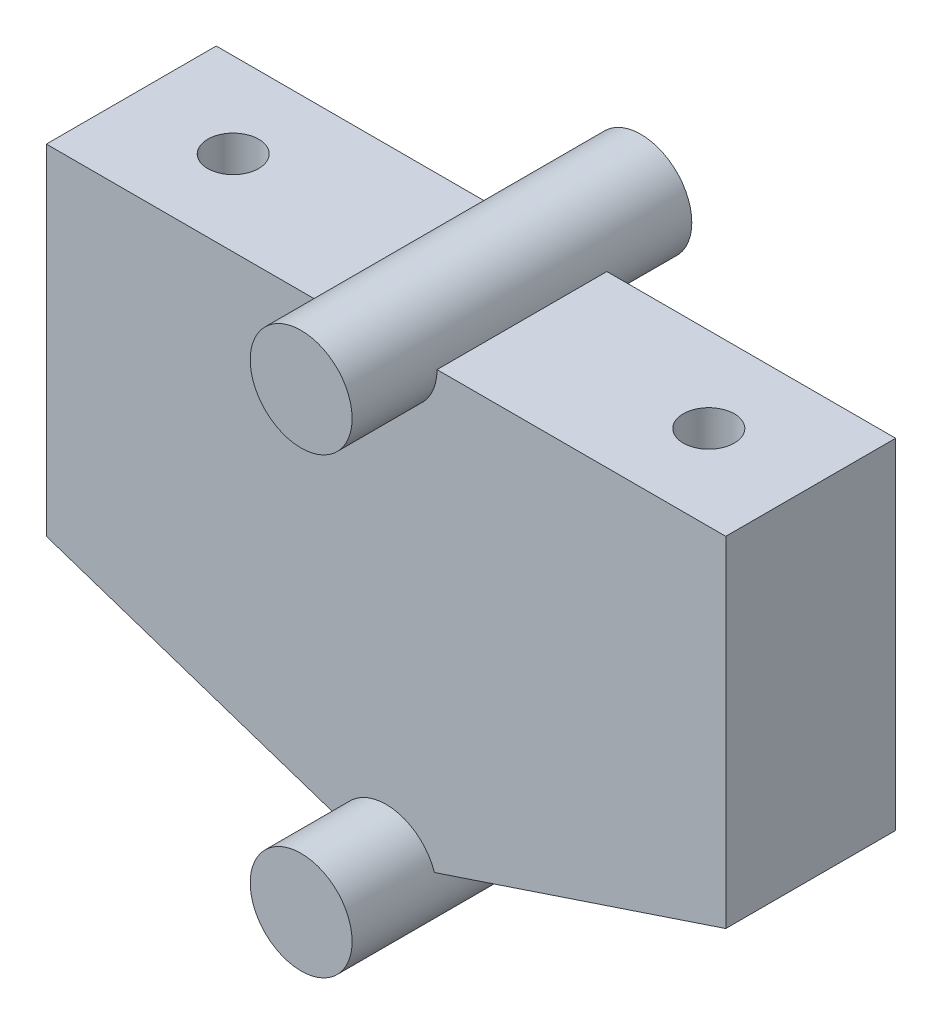
ISO-10303-21;
HEADER;
FILE_DESCRIPTION(('STEP AP214'),'2;1');
FILE_NAME('part.step','',(''),(''),'','','');
FILE_SCHEMA(('AUTOMOTIVE_DESIGN { 1 0 10303 214 1 1 1 1 }'));
ENDSEC;
DATA;
#1=APPLICATION_CONTEXT('core data for automotive mechanical design processes');
#2=APPLICATION_PROTOCOL_DEFINITION('international standard','automotive_design',2000,#1);
#3=PRODUCT_CONTEXT('',#1,'mechanical');
#4=PRODUCT('Part','Part','',(#3));
#5=PRODUCT_RELATED_PRODUCT_CATEGORY('part','',(#4));
#6=PRODUCT_DEFINITION_FORMATION('','',#4);
#7=PRODUCT_DEFINITION_CONTEXT('part definition',#1,'design');
#8=PRODUCT_DEFINITION('design','',#6,#7);
#9=PRODUCT_DEFINITION_SHAPE('','',#8);
#10=(LENGTH_UNIT() NAMED_UNIT(*) SI_UNIT(.MILLI.,.METRE.));
#11=(NAMED_UNIT(*) PLANE_ANGLE_UNIT() SI_UNIT($,.RADIAN.));
#12=(NAMED_UNIT(*) SI_UNIT($,.STERADIAN.) SOLID_ANGLE_UNIT());
#13=UNCERTAINTY_MEASURE_WITH_UNIT(LENGTH_MEASURE(1.E-05),#10,'distance_accuracy_value','');
#14=(GEOMETRIC_REPRESENTATION_CONTEXT(3) GLOBAL_UNCERTAINTY_ASSIGNED_CONTEXT((#13)) GLOBAL_UNIT_ASSIGNED_CONTEXT((#10,
#11,#12)) REPRESENTATION_CONTEXT('',''));
#15=CARTESIAN_POINT('',(0.,0.,0.));
#16=DIRECTION('',(0.,0.,1.));
#17=DIRECTION('',(1.,0.,0.));
#18=AXIS2_PLACEMENT_3D('',#15,#16,#17);
#19=CARTESIAN_POINT('',(0.,10.,10.));
#20=DIRECTION('',(0.,1.,0.));
#21=DIRECTION('',(0.,0.,1.));
#22=AXIS2_PLACEMENT_3D('',#19,#20,#21);
#23=PLANE('',#22);
#24=DIRECTION('',(0.,0.,1.));
#25=VECTOR('',#24,1.);
#26=CARTESIAN_POINT('',(-3.,10.,-5.));
#27=LINE('',#26,#25);
#28=CARTESIAN_POINT('',(-3.,10.,0.));
#29=VERTEX_POINT('',#28);
#30=CARTESIAN_POINT('',(-3.,10.,10.));
#31=VERTEX_POINT('',#30);
#32=EDGE_CURVE('E114',#29,#31,#27,.T.);
#33=ORIENTED_EDGE('',*,*,#32,.F.);
#34=DIRECTION('',(1.,0.,0.));
#35=VECTOR('',#34,1.);
#36=CARTESIAN_POINT('',(0.,10.,0.));
#37=LINE('',#36,#35);
#38=CARTESIAN_POINT('',(-20.,10.,0.));
#39=VERTEX_POINT('',#38);
#40=EDGE_CURVE('E123',#39,#29,#37,.T.);
#41=ORIENTED_EDGE('',*,*,#40,.F.);
#42=DIRECTION('',(0.,0.,-1.));
#43=VECTOR('',#42,1.);
#44=CARTESIAN_POINT('',(-20.,10.,10.));
#45=LINE('',#44,#43);
#46=CARTESIAN_POINT('',(-20.,10.,10.));
#47=VERTEX_POINT('',#46);
#48=EDGE_CURVE('E146',#47,#39,#45,.T.);
#49=ORIENTED_EDGE('',*,*,#48,.F.);
#50=DIRECTION('',(1.,0.,0.));
#51=VECTOR('',#50,1.);
#52=CARTESIAN_POINT('',(0.,10.,10.));
#53=LINE('',#52,#51);
#54=EDGE_CURVE('E124',#47,#31,#53,.T.);
#55=ORIENTED_EDGE('',*,*,#54,.T.);
#56=EDGE_LOOP('',(#33,#41,#49,#55));
#57=FACE_BOUND('',#56,.T.);
#58=CARTESIAN_POINT('',(-14.,10.,5.));
#59=DIRECTION('',(0.,1.,0.));
#60=DIRECTION('',(0.,0.,1.));
#61=AXIS2_PLACEMENT_3D('',#58,#59,#60);
#62=CIRCLE('',#61,1.5);
#63=CARTESIAN_POINT('',(-14.,10.,6.5));
#64=VERTEX_POINT('',#63);
#65=EDGE_CURVE('E157',#64,#64,#62,.T.);
#66=ORIENTED_EDGE('',*,*,#65,.F.);
#67=EDGE_LOOP('',(#66));
#68=FACE_BOUND('',#67,.T.);
#69=ADVANCED_FACE('F39',(#57,#68),#23,.T.);
#70=CARTESIAN_POINT('',(5.,-15.,10.));
#71=DIRECTION('',(-0.316227766016838,0.948683298050514,0.));
#72=DIRECTION('',(-0.948683298050514,-0.316227766016838,0.));
#73=AXIS2_PLACEMENT_3D('',#70,#71,#72);
#74=PLANE('',#73);
#75=CARTESIAN_POINT('',(14.,-12.,5.));
#76=DIRECTION('',(-0.316227766016838,0.948683298050514,0.));
#77=DIRECTION('',(0.948683298050514,0.316227766016838,0.));
#78=AXIS2_PLACEMENT_3D('',#75,#76,#77);
#79=ELLIPSE('',#78,1.58113883008419,1.5);
#80=CARTESIAN_POINT('',(15.5,-11.5,5.));
#81=VERTEX_POINT('',#80);
#82=EDGE_CURVE('E156',#81,#81,#79,.T.);
#83=ORIENTED_EDGE('',*,*,#82,.T.);
#84=EDGE_LOOP('',(#83));
#85=FACE_BOUND('',#84,.T.);
#86=DIRECTION('',(0.948683298050514,0.316227766016838,0.));
#87=VECTOR('',#86,1.);
#88=CARTESIAN_POINT('',(5.,-15.,0.));
#89=LINE('',#88,#87);
#90=CARTESIAN_POINT('',(2.84604989415154,-15.7179833686162,0.));
#91=VERTEX_POINT('',#90);
#92=CARTESIAN_POINT('',(20.,-10.,0.));
#93=VERTEX_POINT('',#92);
#94=EDGE_CURVE('E188',#91,#93,#89,.T.);
#95=ORIENTED_EDGE('',*,*,#94,.T.);
#96=DIRECTION('',(0.,0.,-1.));
#97=VECTOR('',#96,1.);
#98=CARTESIAN_POINT('',(20.,-10.,10.));
#99=LINE('',#98,#97);
#100=CARTESIAN_POINT('',(20.,-10.,10.));
#101=VERTEX_POINT('',#100);
#102=EDGE_CURVE('E151',#101,#93,#99,.T.);
#103=ORIENTED_EDGE('',*,*,#102,.F.);
#104=DIRECTION('',(0.948683298050514,0.316227766016838,0.));
#105=VECTOR('',#104,1.);
#106=CARTESIAN_POINT('',(5.,-15.,10.));
#107=LINE('',#106,#105);
#108=CARTESIAN_POINT('',(2.84604989415154,-15.7179833686162,10.));
#109=VERTEX_POINT('',#108);
#110=EDGE_CURVE('E95',#109,#101,#107,.T.);
#111=ORIENTED_EDGE('',*,*,#110,.F.);
#112=DIRECTION('',(0.,0.,-1.));
#113=VECTOR('',#112,1.);
#114=CARTESIAN_POINT('',(2.84604989415154,-15.7179833686162,10.));
#115=LINE('',#114,#113);
#116=EDGE_CURVE('E47',#109,#91,#115,.T.);
#117=ORIENTED_EDGE('',*,*,#116,.T.);
#118=EDGE_LOOP('',(#95,#103,#111,#117));
#119=FACE_BOUND('',#118,.T.);
#120=ADVANCED_FACE('F41',(#85,#119),#74,.F.);
#121=CARTESIAN_POINT('',(20.,0.,10.));
#122=DIRECTION('',(1.,0.,0.));
#123=DIRECTION('',(0.,1.,0.));
#124=AXIS2_PLACEMENT_3D('',#121,#122,#123);
#125=PLANE('',#124);
#126=DIRECTION('',(0.,-1.,0.));
#127=VECTOR('',#126,1.);
#128=CARTESIAN_POINT('',(20.,0.,0.));
#129=LINE('',#128,#127);
#130=CARTESIAN_POINT('',(20.,10.,0.));
#131=VERTEX_POINT('',#130);
#132=EDGE_CURVE('E135',#131,#93,#129,.T.);
#133=ORIENTED_EDGE('',*,*,#132,.F.);
#134=DIRECTION('',(0.,0.,-1.));
#135=VECTOR('',#134,1.);
#136=CARTESIAN_POINT('',(20.,10.,10.));
#137=LINE('',#136,#135);
#138=CARTESIAN_POINT('',(20.,10.,10.));
#139=VERTEX_POINT('',#138);
#140=EDGE_CURVE('E148',#139,#131,#137,.T.);
#141=ORIENTED_EDGE('',*,*,#140,.F.);
#142=DIRECTION('',(0.,-1.,0.));
#143=VECTOR('',#142,1.);
#144=CARTESIAN_POINT('',(20.,0.,10.));
#145=LINE('',#144,#143);
#146=EDGE_CURVE('E180',#139,#101,#145,.T.);
#147=ORIENTED_EDGE('',*,*,#146,.T.);
#148=ORIENTED_EDGE('',*,*,#102,.T.);
#149=EDGE_LOOP('',(#133,#141,#147,#148));
#150=FACE_BOUND('',#149,.T.);
#151=ADVANCED_FACE('F196',(#150),#125,.T.);
#152=DIRECTION('',(0.,0.,1.));
#153=VECTOR('',#152,1.);
#154=CARTESIAN_POINT('',(3.,10.,-5.));
#155=LINE('',#154,#153);
#156=CARTESIAN_POINT('',(3.,10.,10.));
#157=VERTEX_POINT('',#156);
#158=CARTESIAN_POINT('',(3.,10.,0.));
#159=VERTEX_POINT('',#158);
#160=EDGE_CURVE('E54',#157,#159,#155,.F.);
#161=ORIENTED_EDGE('',*,*,#160,.F.);
#162=EDGE_CURVE('E183',#157,#139,#53,.T.);
#163=ORIENTED_EDGE('',*,*,#162,.T.);
#164=ORIENTED_EDGE('',*,*,#140,.T.);
#165=EDGE_CURVE('E131',#159,#131,#37,.T.);
#166=ORIENTED_EDGE('',*,*,#165,.F.);
#167=EDGE_LOOP('',(#161,#163,#164,#166));
#168=FACE_BOUND('',#167,.T.);
#169=CARTESIAN_POINT('',(14.,10.,5.));
#170=DIRECTION('',(0.,1.,0.));
#171=DIRECTION('',(0.,0.,-1.));
#172=AXIS2_PLACEMENT_3D('',#169,#170,#171);
#173=CIRCLE('',#172,1.5);
#174=CARTESIAN_POINT('',(14.,10.,3.5));
#175=VERTEX_POINT('',#174);
#176=EDGE_CURVE('E164',#175,#175,#173,.T.);
#177=ORIENTED_EDGE('',*,*,#176,.F.);
#178=EDGE_LOOP('',(#177));
#179=FACE_BOUND('',#178,.T.);
#180=ADVANCED_FACE('F207',(#168,#179),#23,.T.);
#181=CARTESIAN_POINT('',(-20.,0.,10.));
#182=DIRECTION('',(1.,0.,0.));
#183=DIRECTION('',(0.,1.,0.));
#184=AXIS2_PLACEMENT_3D('',#181,#182,#183);
#185=PLANE('',#184);
#186=DIRECTION('',(0.,-1.,0.));
#187=VECTOR('',#186,1.);
#188=CARTESIAN_POINT('',(-20.,0.,0.));
#189=LINE('',#188,#187);
#190=CARTESIAN_POINT('',(-20.,-10.,0.));
#191=VERTEX_POINT('',#190);
#192=EDGE_CURVE('E130',#39,#191,#189,.T.);
#193=ORIENTED_EDGE('',*,*,#192,.T.);
#194=DIRECTION('',(0.,0.,-1.));
#195=VECTOR('',#194,1.);
#196=CARTESIAN_POINT('',(-20.,-10.,10.));
#197=LINE('',#196,#195);
#198=CARTESIAN_POINT('',(-20.,-10.,10.));
#199=VERTEX_POINT('',#198);
#200=EDGE_CURVE('E142',#199,#191,#197,.T.);
#201=ORIENTED_EDGE('',*,*,#200,.F.);
#202=DIRECTION('',(0.,-1.,0.));
#203=VECTOR('',#202,1.);
#204=CARTESIAN_POINT('',(-20.,0.,10.));
#205=LINE('',#204,#203);
#206=EDGE_CURVE('E62',#47,#199,#205,.T.);
#207=ORIENTED_EDGE('',*,*,#206,.F.);
#208=ORIENTED_EDGE('',*,*,#48,.T.);
#209=EDGE_LOOP('',(#193,#201,#207,#208));
#210=FACE_BOUND('',#209,.T.);
#211=ADVANCED_FACE('F204',(#210),#185,.F.);
#212=CARTESIAN_POINT('',(-5.,-15.,10.));
#213=DIRECTION('',(0.316227766016838,0.948683298050514,0.));
#214=DIRECTION('',(-0.948683298050514,0.316227766016838,0.));
#215=AXIS2_PLACEMENT_3D('',#212,#213,#214);
#216=PLANE('',#215);
#217=CARTESIAN_POINT('',(-14.,-12.,5.));
#218=DIRECTION('',(0.316227766016838,0.948683298050514,0.));
#219=DIRECTION('',(-0.948683298050514,0.316227766016838,0.));
#220=AXIS2_PLACEMENT_3D('',#217,#218,#219);
#221=ELLIPSE('',#220,1.58113883008419,1.5);
#222=CARTESIAN_POINT('',(-15.5,-11.5,5.));
#223=VERTEX_POINT('',#222);
#224=EDGE_CURVE('E154',#223,#223,#221,.T.);
#225=ORIENTED_EDGE('',*,*,#224,.T.);
#226=EDGE_LOOP('',(#225));
#227=FACE_BOUND('',#226,.T.);
#228=DIRECTION('',(0.948683298050514,-0.316227766016838,0.));
#229=VECTOR('',#228,1.);
#230=CARTESIAN_POINT('',(-5.,-15.,0.));
#231=LINE('',#230,#229);
#232=CARTESIAN_POINT('',(-2.84604989415154,-15.7179833686162,0.));
#233=VERTEX_POINT('',#232);
#234=EDGE_CURVE('E133',#191,#233,#231,.T.);
#235=ORIENTED_EDGE('',*,*,#234,.T.);
#236=DIRECTION('',(0.,0.,-1.));
#237=VECTOR('',#236,1.);
#238=CARTESIAN_POINT('',(-2.84604989415154,-15.7179833686162,10.));
#239=LINE('',#238,#237);
#240=CARTESIAN_POINT('',(-2.84604989415154,-15.7179833686162,10.));
#241=VERTEX_POINT('',#240);
#242=EDGE_CURVE('E88',#241,#233,#239,.T.);
#243=ORIENTED_EDGE('',*,*,#242,.F.);
#244=DIRECTION('',(0.948683298050514,-0.316227766016838,0.));
#245=VECTOR('',#244,1.);
#246=CARTESIAN_POINT('',(-5.,-15.,10.));
#247=LINE('',#246,#245);
#248=EDGE_CURVE('E143',#199,#241,#247,.T.);
#249=ORIENTED_EDGE('',*,*,#248,.F.);
#250=ORIENTED_EDGE('',*,*,#200,.T.);
#251=EDGE_LOOP('',(#235,#243,#249,#250));
#252=FACE_BOUND('',#251,.T.);
#253=ADVANCED_FACE('F202',(#227,#252),#216,.F.);
#254=CARTESIAN_POINT('',(0.,0.,10.));
#255=DIRECTION('',(0.,0.,1.));
#256=DIRECTION('',(1.,0.,0.));
#257=AXIS2_PLACEMENT_3D('',#254,#255,#256);
#258=PLANE('',#257);
#259=CARTESIAN_POINT('',(0.,10.,10.));
#260=DIRECTION('',(0.,0.,1.));
#261=DIRECTION('',(1.,0.,0.));
#262=AXIS2_PLACEMENT_3D('',#259,#260,#261);
#263=CIRCLE('',#262,3.);
#264=EDGE_CURVE('E125',#31,#157,#263,.T.);
#265=ORIENTED_EDGE('',*,*,#264,.F.);
#266=ORIENTED_EDGE('',*,*,#54,.F.);
#267=ORIENTED_EDGE('',*,*,#206,.T.);
#268=ORIENTED_EDGE('',*,*,#248,.T.);
#269=CARTESIAN_POINT('',(0.,-16.6666666666667,10.));
#270=DIRECTION('',(0.,0.,1.));
#271=DIRECTION('',(1.,0.,0.));
#272=AXIS2_PLACEMENT_3D('',#269,#270,#271);
#273=CIRCLE('',#272,3.);
#274=EDGE_CURVE('E140',#109,#241,#273,.T.);
#275=ORIENTED_EDGE('',*,*,#274,.F.);
#276=ORIENTED_EDGE('',*,*,#110,.T.);
#277=ORIENTED_EDGE('',*,*,#146,.F.);
#278=ORIENTED_EDGE('',*,*,#162,.F.);
#279=EDGE_LOOP('',(#265,#266,#267,#268,#275,#276,#277,#278));
#280=FACE_BOUND('',#279,.T.);
#281=ADVANCED_FACE('F197',(#280),#258,.T.);
#282=CARTESIAN_POINT('',(0.,0.,0.));
#283=DIRECTION('',(0.,0.,1.));
#284=DIRECTION('',(1.,0.,0.));
#285=AXIS2_PLACEMENT_3D('',#282,#283,#284);
#286=PLANE('',#285);
#287=ORIENTED_EDGE('',*,*,#40,.T.);
#288=CARTESIAN_POINT('',(0.,10.,0.));
#289=DIRECTION('',(0.,0.,1.));
#290=DIRECTION('',(1.,0.,0.));
#291=AXIS2_PLACEMENT_3D('',#288,#289,#290);
#292=CIRCLE('',#291,3.);
#293=EDGE_CURVE('E11',#29,#159,#292,.T.);
#294=ORIENTED_EDGE('',*,*,#293,.T.);
#295=ORIENTED_EDGE('',*,*,#165,.T.);
#296=ORIENTED_EDGE('',*,*,#132,.T.);
#297=ORIENTED_EDGE('',*,*,#94,.F.);
#298=CARTESIAN_POINT('',(0.,-16.6666666666667,0.));
#299=DIRECTION('',(0.,0.,1.));
#300=DIRECTION('',(1.,0.,0.));
#301=AXIS2_PLACEMENT_3D('',#298,#299,#300);
#302=CIRCLE('',#301,3.);
#303=EDGE_CURVE('E177',#91,#233,#302,.T.);
#304=ORIENTED_EDGE('',*,*,#303,.T.);
#305=ORIENTED_EDGE('',*,*,#234,.F.);
#306=ORIENTED_EDGE('',*,*,#192,.F.);
#307=EDGE_LOOP('',(#287,#294,#295,#296,#297,#304,#305,#306));
#308=FACE_BOUND('',#307,.T.);
#309=ADVANCED_FACE('F128',(#308),#286,.F.);
#310=CARTESIAN_POINT('',(0.,-16.6666666666667,-5.));
#311=DIRECTION('',(0.,0.,1.));
#312=DIRECTION('',(1.,0.,0.));
#313=AXIS2_PLACEMENT_3D('',#310,#311,#312);
#314=CYLINDRICAL_SURFACE('',#313,3.);
#315=ORIENTED_EDGE('',*,*,#116,.F.);
#316=ORIENTED_EDGE('',*,*,#274,.T.);
#317=ORIENTED_EDGE('',*,*,#242,.T.);
#318=ORIENTED_EDGE('',*,*,#303,.F.);
#319=EDGE_LOOP('',(#315,#316,#317,#318));
#320=FACE_BOUND('',#319,.T.);
#321=CARTESIAN_POINT('',(0.,-16.6666666666667,-5.));
#322=DIRECTION('',(0.,0.,1.));
#323=DIRECTION('',(1.,0.,0.));
#324=AXIS2_PLACEMENT_3D('',#321,#322,#323);
#325=CIRCLE('',#324,3.);
#326=CARTESIAN_POINT('',(3.,-16.6666666666667,-5.));
#327=VERTEX_POINT('',#326);
#328=EDGE_CURVE('E174',#327,#327,#325,.T.);
#329=ORIENTED_EDGE('',*,*,#328,.T.);
#330=EDGE_LOOP('',(#329));
#331=FACE_BOUND('',#330,.T.);
#332=CARTESIAN_POINT('',(0.,-16.6666666666667,15.));
#333=DIRECTION('',(0.,0.,1.));
#334=DIRECTION('',(1.,0.,0.));
#335=AXIS2_PLACEMENT_3D('',#332,#333,#334);
#336=CIRCLE('',#335,3.);
#337=CARTESIAN_POINT('',(3.,-16.6666666666667,15.));
#338=VERTEX_POINT('',#337);
#339=EDGE_CURVE('E161',#338,#338,#336,.T.);
#340=ORIENTED_EDGE('',*,*,#339,.F.);
#341=EDGE_LOOP('',(#340));
#342=FACE_BOUND('',#341,.T.);
#343=ADVANCED_FACE('F199',(#320,#331,#342),#314,.T.);
#344=CARTESIAN_POINT('',(0.,0.,-5.));
#345=DIRECTION('',(0.,0.,1.));
#346=DIRECTION('',(1.,0.,0.));
#347=AXIS2_PLACEMENT_3D('',#344,#345,#346);
#348=PLANE('',#347);
#349=ORIENTED_EDGE('',*,*,#328,.F.);
#350=EDGE_LOOP('',(#349));
#351=FACE_BOUND('',#350,.T.);
#352=ADVANCED_FACE('F332',(#351),#348,.F.);
#353=CARTESIAN_POINT('',(0.,0.,15.));
#354=DIRECTION('',(0.,0.,1.));
#355=DIRECTION('',(1.,0.,0.));
#356=AXIS2_PLACEMENT_3D('',#353,#354,#355);
#357=PLANE('',#356);
#358=ORIENTED_EDGE('',*,*,#339,.T.);
#359=EDGE_LOOP('',(#358));
#360=FACE_BOUND('',#359,.T.);
#361=ADVANCED_FACE('F259',(#360),#357,.T.);
#362=CARTESIAN_POINT('',(-14.,-19.6666666666667,5.));
#363=DIRECTION('',(0.,1.,0.));
#364=DIRECTION('',(0.,0.,1.));
#365=AXIS2_PLACEMENT_3D('',#362,#363,#364);
#366=CYLINDRICAL_SURFACE('',#365,1.5);
#367=ORIENTED_EDGE('',*,*,#65,.T.);
#368=EDGE_LOOP('',(#367));
#369=FACE_BOUND('',#368,.T.);
#370=ORIENTED_EDGE('',*,*,#224,.F.);
#371=EDGE_LOOP('',(#370));
#372=FACE_BOUND('',#371,.T.);
#373=ADVANCED_FACE('F230',(#369,#372),#366,.F.);
#374=CARTESIAN_POINT('',(14.,-19.6666666666667,5.));
#375=DIRECTION('',(0.,1.,0.));
#376=DIRECTION('',(0.,0.,1.));
#377=AXIS2_PLACEMENT_3D('',#374,#375,#376);
#378=CYLINDRICAL_SURFACE('',#377,1.5);
#379=ORIENTED_EDGE('',*,*,#176,.T.);
#380=EDGE_LOOP('',(#379));
#381=FACE_BOUND('',#380,.T.);
#382=ORIENTED_EDGE('',*,*,#82,.F.);
#383=EDGE_LOOP('',(#382));
#384=FACE_BOUND('',#383,.T.);
#385=ADVANCED_FACE('F222',(#381,#384),#378,.F.);
#386=CARTESIAN_POINT('',(0.,10.,-5.));
#387=DIRECTION('',(0.,0.,1.));
#388=DIRECTION('',(1.,0.,0.));
#389=AXIS2_PLACEMENT_3D('',#386,#387,#388);
#390=CYLINDRICAL_SURFACE('',#389,3.);
#391=ORIENTED_EDGE('',*,*,#32,.T.);
#392=ORIENTED_EDGE('',*,*,#264,.T.);
#393=ORIENTED_EDGE('',*,*,#160,.T.);
#394=ORIENTED_EDGE('',*,*,#293,.F.);
#395=EDGE_LOOP('',(#391,#392,#393,#394));
#396=FACE_BOUND('',#395,.T.);
#397=CARTESIAN_POINT('',(0.,10.,-5.));
#398=DIRECTION('',(0.,0.,1.));
#399=DIRECTION('',(1.,0.,0.));
#400=AXIS2_PLACEMENT_3D('',#397,#398,#399);
#401=CIRCLE('',#400,3.);
#402=CARTESIAN_POINT('',(3.,10.,-5.));
#403=VERTEX_POINT('',#402);
#404=EDGE_CURVE('E209',#403,#403,#401,.T.);
#405=ORIENTED_EDGE('',*,*,#404,.T.);
#406=EDGE_LOOP('',(#405));
#407=FACE_BOUND('',#406,.T.);
#408=CARTESIAN_POINT('',(0.,10.,15.));
#409=DIRECTION('',(0.,0.,1.));
#410=DIRECTION('',(1.,0.,0.));
#411=AXIS2_PLACEMENT_3D('',#408,#409,#410);
#412=CIRCLE('',#411,3.);
#413=CARTESIAN_POINT('',(3.,10.,15.));
#414=VERTEX_POINT('',#413);
#415=EDGE_CURVE('E212',#414,#414,#412,.T.);
#416=ORIENTED_EDGE('',*,*,#415,.F.);
#417=EDGE_LOOP('',(#416));
#418=FACE_BOUND('',#417,.T.);
#419=ADVANCED_FACE('F112',(#396,#407,#418),#390,.T.);
#420=CARTESIAN_POINT('',(0.,10.,-5.));
#421=DIRECTION('',(0.,0.,1.));
#422=DIRECTION('',(1.,0.,0.));
#423=AXIS2_PLACEMENT_3D('',#420,#421,#422);
#424=PLANE('',#423);
#425=ORIENTED_EDGE('',*,*,#404,.F.);
#426=EDGE_LOOP('',(#425));
#427=FACE_BOUND('',#426,.T.);
#428=ADVANCED_FACE('F221',(#427),#424,.F.);
#429=CARTESIAN_POINT('',(0.,10.,15.));
#430=DIRECTION('',(0.,0.,1.));
#431=DIRECTION('',(1.,0.,0.));
#432=AXIS2_PLACEMENT_3D('',#429,#430,#431);
#433=PLANE('',#432);
#434=ORIENTED_EDGE('',*,*,#415,.T.);
#435=EDGE_LOOP('',(#434));
#436=FACE_BOUND('',#435,.T.);
#437=ADVANCED_FACE('F218',(#436),#433,.T.);
#438=CLOSED_SHELL('',(#69,#120,#151,#180,#211,#253,#281,#309,#343,#352,#361,#373,#385,#419,#428,#437));
#439=MANIFOLD_SOLID_BREP('B2',#438);
#440=ADVANCED_BREP_SHAPE_REPRESENTATION('',(#18,#439),#14);
#441=SHAPE_DEFINITION_REPRESENTATION(#9,#440);
ENDSEC;
END-ISO-10303-21;
